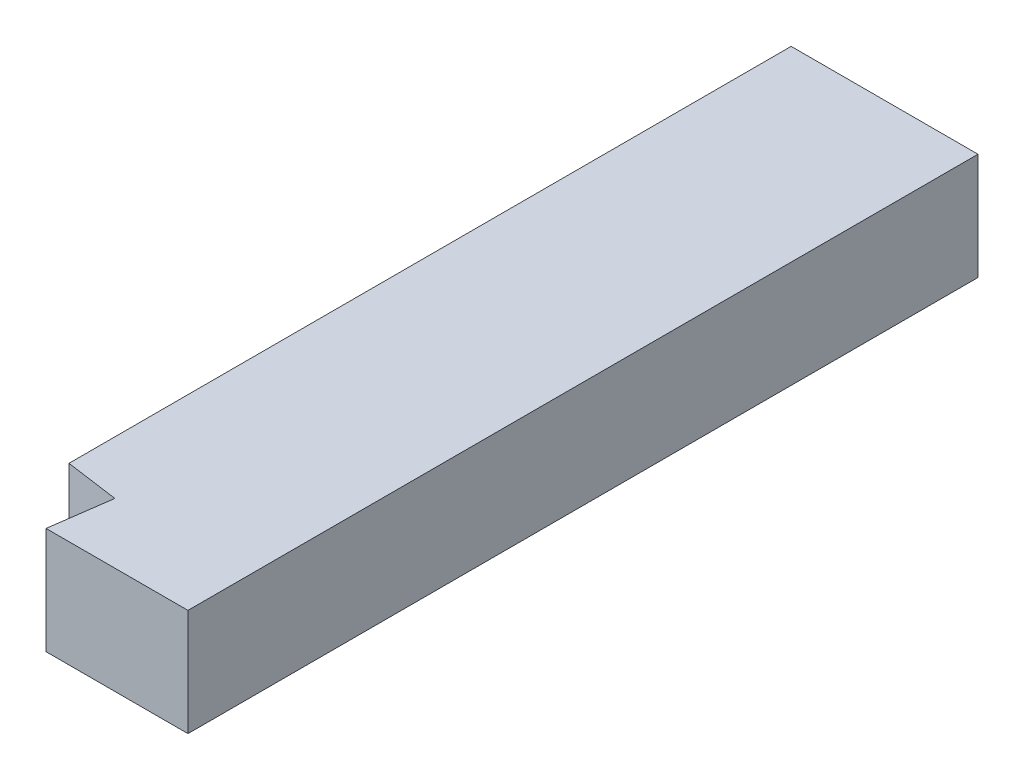
ISO-10303-21;
HEADER;
FILE_DESCRIPTION(('STEP AP214'),'2;1');
FILE_NAME('part.step','',(''),(''),'','','');
FILE_SCHEMA(('AUTOMOTIVE_DESIGN { 1 0 10303 214 1 1 1 1 }'));
ENDSEC;
DATA;
#1=APPLICATION_CONTEXT('core data for automotive mechanical design processes');
#2=APPLICATION_PROTOCOL_DEFINITION('international standard','automotive_design',2000,#1);
#3=PRODUCT_CONTEXT('',#1,'mechanical');
#4=PRODUCT('Part','Part','',(#3));
#5=PRODUCT_RELATED_PRODUCT_CATEGORY('part','',(#4));
#6=PRODUCT_DEFINITION_FORMATION('','',#4);
#7=PRODUCT_DEFINITION_CONTEXT('part definition',#1,'design');
#8=PRODUCT_DEFINITION('design','',#6,#7);
#9=PRODUCT_DEFINITION_SHAPE('','',#8);
#10=(LENGTH_UNIT() NAMED_UNIT(*) SI_UNIT(.MILLI.,.METRE.));
#11=(NAMED_UNIT(*) PLANE_ANGLE_UNIT() SI_UNIT($,.RADIAN.));
#12=(NAMED_UNIT(*) SI_UNIT($,.STERADIAN.) SOLID_ANGLE_UNIT());
#13=UNCERTAINTY_MEASURE_WITH_UNIT(LENGTH_MEASURE(1.E-05),#10,'distance_accuracy_value','');
#14=(GEOMETRIC_REPRESENTATION_CONTEXT(3) GLOBAL_UNCERTAINTY_ASSIGNED_CONTEXT((#13)) GLOBAL_UNIT_ASSIGNED_CONTEXT((#10,
#11,#12)) REPRESENTATION_CONTEXT('',''));
#15=CARTESIAN_POINT('',(0.,0.,0.));
#16=DIRECTION('',(0.,0.,1.));
#17=DIRECTION('',(1.,0.,0.));
#18=AXIS2_PLACEMENT_3D('',#15,#16,#17);
#19=CARTESIAN_POINT('',(-50.8,25.4,375.907215418));
#20=DIRECTION('',(0.,-1.,0.));
#21=DIRECTION('',(0.,0.,-1.));
#22=AXIS2_PLACEMENT_3D('',#19,#20,#21);
#23=PLANE('',#22);
#24=DIRECTION('',(-1.,0.,0.));
#25=VECTOR('',#24,1.);
#26=CARTESIAN_POINT('',(-50.8,25.4,375.907215418));
#27=LINE('',#26,#25);
#28=CARTESIAN_POINT('',(38.1,25.4,375.907215418));
#29=VERTEX_POINT('',#28);
#30=CARTESIAN_POINT('',(-29.4373727748296,25.4,375.907215418));
#31=VERTEX_POINT('',#30);
#32=EDGE_CURVE('E112',#29,#31,#27,.T.);
#33=ORIENTED_EDGE('',*,*,#32,.F.);
#34=DIRECTION('',(0.,0.,1.));
#35=VECTOR('',#34,1.);
#36=CARTESIAN_POINT('',(38.1,25.4,375.907215418));
#37=LINE('',#36,#35);
#38=CARTESIAN_POINT('',(38.1,25.4,0.));
#39=VERTEX_POINT('',#38);
#40=EDGE_CURVE('E93',#39,#29,#37,.T.);
#41=ORIENTED_EDGE('',*,*,#40,.F.);
#42=DIRECTION('',(-1.,0.,0.));
#43=VECTOR('',#42,1.);
#44=CARTESIAN_POINT('',(-50.8,25.4,0.));
#45=LINE('',#44,#43);
#46=CARTESIAN_POINT('',(-50.8,25.4,0.));
#47=VERTEX_POINT('',#46);
#48=EDGE_CURVE('E119',#39,#47,#45,.T.);
#49=ORIENTED_EDGE('',*,*,#48,.T.);
#50=DIRECTION('',(0.,0.,-1.));
#51=VECTOR('',#50,1.);
#52=CARTESIAN_POINT('',(-50.8,25.4,375.907215418));
#53=LINE('',#52,#51);
#54=CARTESIAN_POINT('',(-50.8,25.4,343.610078216559));
#55=VERTEX_POINT('',#54);
#56=EDGE_CURVE('E11',#55,#47,#53,.T.);
#57=ORIENTED_EDGE('',*,*,#56,.F.);
#58=DIRECTION('',(0.99026806874157,0.,0.139173100960071));
#59=VECTOR('',#58,1.);
#60=CARTESIAN_POINT('',(-46.3488512506679,25.4,344.235646377175));
#61=LINE('',#60,#59);
#62=CARTESIAN_POINT('',(-25.4,25.4,347.179815418));
#63=VERTEX_POINT('',#62);
#64=EDGE_CURVE('E123',#55,#63,#61,.T.);
#65=ORIENTED_EDGE('',*,*,#64,.T.);
#66=DIRECTION('',(-0.139173100960069,0.,0.99026806874157));
#67=VECTOR('',#66,1.);
#68=CARTESIAN_POINT('',(-29.8511487493321,25.4,378.851384458825));
#69=LINE('',#68,#67);
#70=EDGE_CURVE('E131',#63,#31,#69,.T.);
#71=ORIENTED_EDGE('',*,*,#70,.T.);
#72=EDGE_LOOP('',(#33,#41,#49,#57,#65,#71));
#73=FACE_BOUND('',#72,.T.);
#74=ADVANCED_FACE('F38',(#73),#23,.F.);
#75=CARTESIAN_POINT('',(-50.8,25.4,375.907215418));
#76=DIRECTION('',(1.,0.,0.));
#77=DIRECTION('',(0.,1.,0.));
#78=AXIS2_PLACEMENT_3D('',#75,#76,#77);
#79=PLANE('',#78);
#80=DIRECTION('',(0.,0.,-1.));
#81=VECTOR('',#80,1.);
#82=CARTESIAN_POINT('',(-50.8,-25.4,375.907215418));
#83=LINE('',#82,#81);
#84=CARTESIAN_POINT('',(-50.8,-25.4,343.610078216559));
#85=VERTEX_POINT('',#84);
#86=CARTESIAN_POINT('',(-50.8,-25.4,0.));
#87=VERTEX_POINT('',#86);
#88=EDGE_CURVE('E46',#85,#87,#83,.T.);
#89=ORIENTED_EDGE('',*,*,#88,.F.);
#90=DIRECTION('',(0.,1.,0.));
#91=VECTOR('',#90,1.);
#92=CARTESIAN_POINT('',(-50.8,-25.4,343.610078216559));
#93=LINE('',#92,#91);
#94=EDGE_CURVE('E134',#85,#55,#93,.T.);
#95=ORIENTED_EDGE('',*,*,#94,.T.);
#96=ORIENTED_EDGE('',*,*,#56,.T.);
#97=DIRECTION('',(0.,-1.,0.));
#98=VECTOR('',#97,1.);
#99=CARTESIAN_POINT('',(-50.8,25.4,0.));
#100=LINE('',#99,#98);
#101=EDGE_CURVE('E122',#47,#87,#100,.T.);
#102=ORIENTED_EDGE('',*,*,#101,.T.);
#103=EDGE_LOOP('',(#89,#95,#96,#102));
#104=FACE_BOUND('',#103,.T.);
#105=ADVANCED_FACE('F162',(#104),#79,.F.);
#106=CARTESIAN_POINT('',(-50.8,-25.4,375.907215418));
#107=DIRECTION('',(0.,1.,0.));
#108=DIRECTION('',(0.,0.,1.));
#109=AXIS2_PLACEMENT_3D('',#106,#107,#108);
#110=PLANE('',#109);
#111=DIRECTION('',(1.,0.,0.));
#112=VECTOR('',#111,1.);
#113=CARTESIAN_POINT('',(-50.8,-25.4,0.));
#114=LINE('',#113,#112);
#115=CARTESIAN_POINT('',(38.1,-25.4,0.));
#116=VERTEX_POINT('',#115);
#117=EDGE_CURVE('E106',#87,#116,#114,.T.);
#118=ORIENTED_EDGE('',*,*,#117,.T.);
#119=DIRECTION('',(0.,0.,1.));
#120=VECTOR('',#119,1.);
#121=CARTESIAN_POINT('',(38.1,-25.4,375.907215418));
#122=LINE('',#121,#120);
#123=CARTESIAN_POINT('',(38.1,-25.4,375.907215418));
#124=VERTEX_POINT('',#123);
#125=EDGE_CURVE('E53',#116,#124,#122,.T.);
#126=ORIENTED_EDGE('',*,*,#125,.T.);
#127=DIRECTION('',(1.,0.,0.));
#128=VECTOR('',#127,1.);
#129=CARTESIAN_POINT('',(-50.8,-25.4,375.907215418));
#130=LINE('',#129,#128);
#131=CARTESIAN_POINT('',(-29.4373727748296,-25.4,375.907215418));
#132=VERTEX_POINT('',#131);
#133=EDGE_CURVE('E104',#132,#124,#130,.T.);
#134=ORIENTED_EDGE('',*,*,#133,.F.);
#135=DIRECTION('',(0.139173100960069,0.,-0.99026806874157));
#136=VECTOR('',#135,1.);
#137=CARTESIAN_POINT('',(-25.4,-25.4,347.179815418));
#138=LINE('',#137,#136);
#139=CARTESIAN_POINT('',(-25.4,-25.4,347.179815418));
#140=VERTEX_POINT('',#139);
#141=EDGE_CURVE('E61',#132,#140,#138,.T.);
#142=ORIENTED_EDGE('',*,*,#141,.T.);
#143=DIRECTION('',(-0.990268068741569,0.,-0.139173100960071));
#144=VECTOR('',#143,1.);
#145=CARTESIAN_POINT('',(-50.8,-25.4,343.610078216559));
#146=LINE('',#145,#144);
#147=EDGE_CURVE('E144',#140,#85,#146,.T.);
#148=ORIENTED_EDGE('',*,*,#147,.T.);
#149=ORIENTED_EDGE('',*,*,#88,.T.);
#150=EDGE_LOOP('',(#118,#126,#134,#142,#148,#149));
#151=FACE_BOUND('',#150,.T.);
#152=ADVANCED_FACE('F103',(#151),#110,.F.);
#153=CARTESIAN_POINT('',(0.,0.,375.907215418));
#154=DIRECTION('',(0.,0.,1.));
#155=DIRECTION('',(1.,0.,0.));
#156=AXIS2_PLACEMENT_3D('',#153,#154,#155);
#157=PLANE('',#156);
#158=DIRECTION('',(0.,1.,0.));
#159=VECTOR('',#158,1.);
#160=CARTESIAN_POINT('',(38.1,-25.4,375.907215418));
#161=LINE('',#160,#159);
#162=EDGE_CURVE('E90',#124,#29,#161,.T.);
#163=ORIENTED_EDGE('',*,*,#162,.T.);
#164=ORIENTED_EDGE('',*,*,#32,.T.);
#165=DIRECTION('',(0.,1.,0.));
#166=VECTOR('',#165,1.);
#167=CARTESIAN_POINT('',(-29.4373727748296,-25.4,375.907215418));
#168=LINE('',#167,#166);
#169=EDGE_CURVE('E110',#132,#31,#168,.T.);
#170=ORIENTED_EDGE('',*,*,#169,.F.);
#171=ORIENTED_EDGE('',*,*,#133,.T.);
#172=EDGE_LOOP('',(#163,#164,#170,#171));
#173=FACE_BOUND('',#172,.T.);
#174=ADVANCED_FACE('F109',(#173),#157,.T.);
#175=CARTESIAN_POINT('',(0.,0.,0.));
#176=DIRECTION('',(0.,0.,1.));
#177=DIRECTION('',(1.,0.,0.));
#178=AXIS2_PLACEMENT_3D('',#175,#176,#177);
#179=PLANE('',#178);
#180=ORIENTED_EDGE('',*,*,#48,.F.);
#181=DIRECTION('',(0.,1.,0.));
#182=VECTOR('',#181,1.);
#183=CARTESIAN_POINT('',(38.1,-25.4,0.));
#184=LINE('',#183,#182);
#185=EDGE_CURVE('E98',#116,#39,#184,.T.);
#186=ORIENTED_EDGE('',*,*,#185,.F.);
#187=ORIENTED_EDGE('',*,*,#117,.F.);
#188=ORIENTED_EDGE('',*,*,#101,.F.);
#189=EDGE_LOOP('',(#180,#186,#187,#188));
#190=FACE_BOUND('',#189,.T.);
#191=ADVANCED_FACE('F159',(#190),#179,.F.);
#192=CARTESIAN_POINT('',(-50.8,-25.4,343.610078216559));
#193=DIRECTION('',(0.139173100960071,0.,-0.99026806874157));
#194=DIRECTION('',(-0.99026806874157,0.,-0.139173100960071));
#195=AXIS2_PLACEMENT_3D('',#192,#193,#194);
#196=PLANE('',#195);
#197=ORIENTED_EDGE('',*,*,#94,.F.);
#198=ORIENTED_EDGE('',*,*,#147,.F.);
#199=DIRECTION('',(0.,1.,0.));
#200=VECTOR('',#199,1.);
#201=CARTESIAN_POINT('',(-25.4,-25.4,347.179815418));
#202=LINE('',#201,#200);
#203=EDGE_CURVE('E138',#140,#63,#202,.T.);
#204=ORIENTED_EDGE('',*,*,#203,.T.);
#205=ORIENTED_EDGE('',*,*,#64,.F.);
#206=EDGE_LOOP('',(#197,#198,#204,#205));
#207=FACE_BOUND('',#206,.T.);
#208=ADVANCED_FACE('F164',(#207),#196,.F.);
#209=CARTESIAN_POINT('',(-25.4,-25.4,347.179815418));
#210=DIRECTION('',(0.99026806874157,0.,0.139173100960069));
#211=DIRECTION('',(0.139173100960069,0.,-0.99026806874157));
#212=AXIS2_PLACEMENT_3D('',#209,#210,#211);
#213=PLANE('',#212);
#214=ORIENTED_EDGE('',*,*,#203,.F.);
#215=ORIENTED_EDGE('',*,*,#141,.F.);
#216=ORIENTED_EDGE('',*,*,#169,.T.);
#217=ORIENTED_EDGE('',*,*,#70,.F.);
#218=EDGE_LOOP('',(#214,#215,#216,#217));
#219=FACE_BOUND('',#218,.T.);
#220=ADVANCED_FACE('F166',(#219),#213,.F.);
#221=CARTESIAN_POINT('',(38.1,-25.4,375.907215418));
#222=DIRECTION('',(-1.,0.,0.));
#223=DIRECTION('',(0.,0.,1.));
#224=AXIS2_PLACEMENT_3D('',#221,#222,#223);
#225=PLANE('',#224);
#226=ORIENTED_EDGE('',*,*,#40,.T.);
#227=ORIENTED_EDGE('',*,*,#162,.F.);
#228=ORIENTED_EDGE('',*,*,#125,.F.);
#229=ORIENTED_EDGE('',*,*,#185,.T.);
#230=EDGE_LOOP('',(#226,#227,#228,#229));
#231=FACE_BOUND('',#230,.T.);
#232=ADVANCED_FACE('F91',(#231),#225,.F.);
#233=CLOSED_SHELL('',(#74,#105,#152,#174,#191,#208,#220,#232));
#234=MANIFOLD_SOLID_BREP('B2',#233);
#235=ADVANCED_BREP_SHAPE_REPRESENTATION('',(#18,#234),#14);
#236=SHAPE_DEFINITION_REPRESENTATION(#9,#235);
ENDSEC;
END-ISO-10303-21;
